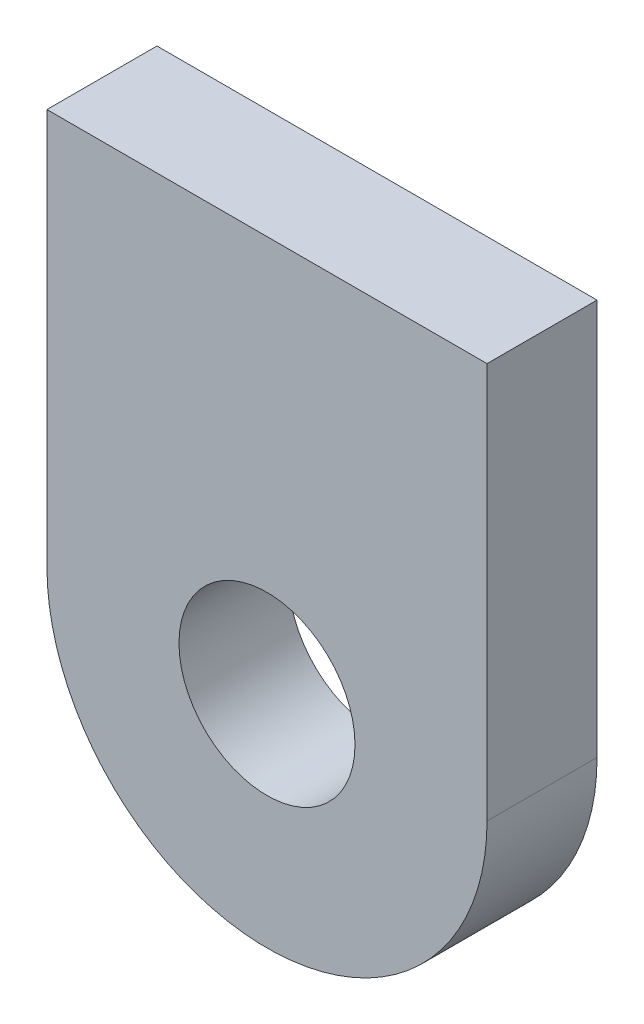
ISO-10303-21;
HEADER;
FILE_DESCRIPTION(('STEP AP214'),'2;1');
FILE_NAME('part.step','',(''),(''),'','','');
FILE_SCHEMA(('AUTOMOTIVE_DESIGN { 1 0 10303 214 1 1 1 1 }'));
ENDSEC;
DATA;
#1=APPLICATION_CONTEXT('core data for automotive mechanical design processes');
#2=APPLICATION_PROTOCOL_DEFINITION('international standard','automotive_design',2000,#1);
#3=PRODUCT_CONTEXT('',#1,'mechanical');
#4=PRODUCT('Part','Part','',(#3));
#5=PRODUCT_RELATED_PRODUCT_CATEGORY('part','',(#4));
#6=PRODUCT_DEFINITION_FORMATION('','',#4);
#7=PRODUCT_DEFINITION_CONTEXT('part definition',#1,'design');
#8=PRODUCT_DEFINITION('design','',#6,#7);
#9=PRODUCT_DEFINITION_SHAPE('','',#8);
#10=(LENGTH_UNIT() NAMED_UNIT(*) SI_UNIT(.MILLI.,.METRE.));
#11=(NAMED_UNIT(*) PLANE_ANGLE_UNIT() SI_UNIT($,.RADIAN.));
#12=(NAMED_UNIT(*) SI_UNIT($,.STERADIAN.) SOLID_ANGLE_UNIT());
#13=UNCERTAINTY_MEASURE_WITH_UNIT(LENGTH_MEASURE(1.E-05),#10,'distance_accuracy_value','');
#14=(GEOMETRIC_REPRESENTATION_CONTEXT(3) GLOBAL_UNCERTAINTY_ASSIGNED_CONTEXT((#13)) GLOBAL_UNIT_ASSIGNED_CONTEXT((#10,
#11,#12)) REPRESENTATION_CONTEXT('',''));
#15=CARTESIAN_POINT('',(0.,0.,0.));
#16=DIRECTION('',(0.,0.,1.));
#17=DIRECTION('',(1.,0.,0.));
#18=AXIS2_PLACEMENT_3D('',#15,#16,#17);
#19=CARTESIAN_POINT('',(0.,0.,5.));
#20=DIRECTION('',(0.,0.,1.));
#21=DIRECTION('',(1.,0.,0.));
#22=AXIS2_PLACEMENT_3D('',#19,#20,#21);
#23=PLANE('',#22);
#24=DIRECTION('',(0.,1.,0.));
#25=VECTOR('',#24,1.);
#26=CARTESIAN_POINT('',(10.,18.,5.));
#27=LINE('',#26,#25);
#28=CARTESIAN_POINT('',(10.,0.,5.));
#29=VERTEX_POINT('',#28);
#30=CARTESIAN_POINT('',(10.,18.,5.));
#31=VERTEX_POINT('',#30);
#32=EDGE_CURVE('E51',#29,#31,#27,.T.);
#33=ORIENTED_EDGE('',*,*,#32,.T.);
#34=DIRECTION('',(-1.,0.,0.));
#35=VECTOR('',#34,1.);
#36=CARTESIAN_POINT('',(-9.99999999999995,18.,5.));
#37=LINE('',#36,#35);
#38=CARTESIAN_POINT('',(-9.99999999999995,18.,5.));
#39=VERTEX_POINT('',#38);
#40=EDGE_CURVE('E81',#31,#39,#37,.T.);
#41=ORIENTED_EDGE('',*,*,#40,.T.);
#42=DIRECTION('',(0.,-1.,0.));
#43=VECTOR('',#42,1.);
#44=CARTESIAN_POINT('',(-9.99999999999995,15.,5.));
#45=LINE('',#44,#43);
#46=CARTESIAN_POINT('',(-9.99999999999995,0.,5.));
#47=VERTEX_POINT('',#46);
#48=EDGE_CURVE('E85',#39,#47,#45,.T.);
#49=ORIENTED_EDGE('',*,*,#48,.T.);
#50=CARTESIAN_POINT('',(0.,0.,5.));
#51=DIRECTION('',(0.,0.,1.));
#52=DIRECTION('',(1.,0.,0.));
#53=AXIS2_PLACEMENT_3D('',#50,#51,#52);
#54=CIRCLE('',#53,10.);
#55=EDGE_CURVE('E93',#47,#29,#54,.T.);
#56=ORIENTED_EDGE('',*,*,#55,.T.);
#57=EDGE_LOOP('',(#33,#41,#49,#56));
#58=FACE_BOUND('',#57,.T.);
#59=CARTESIAN_POINT('',(0.,0.,5.));
#60=DIRECTION('',(0.,0.,1.));
#61=DIRECTION('',(1.,0.,0.));
#62=AXIS2_PLACEMENT_3D('',#59,#60,#61);
#63=CIRCLE('',#62,4.);
#64=CARTESIAN_POINT('',(4.,0.,5.));
#65=VERTEX_POINT('',#64);
#66=EDGE_CURVE('E100',#65,#65,#63,.T.);
#67=ORIENTED_EDGE('',*,*,#66,.F.);
#68=EDGE_LOOP('',(#67));
#69=FACE_BOUND('',#68,.T.);
#70=ADVANCED_FACE('F34',(#58,#69),#23,.T.);
#71=CARTESIAN_POINT('',(0.,0.,0.));
#72=DIRECTION('',(0.,0.,1.));
#73=DIRECTION('',(1.,0.,0.));
#74=AXIS2_PLACEMENT_3D('',#71,#72,#73);
#75=PLANE('',#74);
#76=DIRECTION('',(-1.,0.,0.));
#77=VECTOR('',#76,1.);
#78=CARTESIAN_POINT('',(-9.99999999999995,18.,0.));
#79=LINE('',#78,#77);
#80=CARTESIAN_POINT('',(10.,18.,0.));
#81=VERTEX_POINT('',#80);
#82=CARTESIAN_POINT('',(-9.99999999999995,18.,0.));
#83=VERTEX_POINT('',#82);
#84=EDGE_CURVE('E89',#81,#83,#79,.T.);
#85=ORIENTED_EDGE('',*,*,#84,.F.);
#86=DIRECTION('',(0.,1.,0.));
#87=VECTOR('',#86,1.);
#88=CARTESIAN_POINT('',(10.,0.,0.));
#89=LINE('',#88,#87);
#90=CARTESIAN_POINT('',(10.,0.,0.));
#91=VERTEX_POINT('',#90);
#92=EDGE_CURVE('E103',#91,#81,#89,.T.);
#93=ORIENTED_EDGE('',*,*,#92,.F.);
#94=CARTESIAN_POINT('',(0.,0.,0.));
#95=DIRECTION('',(0.,0.,1.));
#96=DIRECTION('',(1.,0.,0.));
#97=AXIS2_PLACEMENT_3D('',#94,#95,#96);
#98=CIRCLE('',#97,10.);
#99=CARTESIAN_POINT('',(-9.99999999999995,0.,0.));
#100=VERTEX_POINT('',#99);
#101=EDGE_CURVE('E75',#100,#91,#98,.T.);
#102=ORIENTED_EDGE('',*,*,#101,.F.);
#103=DIRECTION('',(0.,-1.,0.));
#104=VECTOR('',#103,1.);
#105=CARTESIAN_POINT('',(-9.99999999999995,15.,0.));
#106=LINE('',#105,#104);
#107=EDGE_CURVE('E68',#83,#100,#106,.T.);
#108=ORIENTED_EDGE('',*,*,#107,.F.);
#109=EDGE_LOOP('',(#85,#93,#102,#108));
#110=FACE_BOUND('',#109,.T.);
#111=CARTESIAN_POINT('',(0.,0.,0.));
#112=DIRECTION('',(0.,0.,1.));
#113=DIRECTION('',(1.,0.,0.));
#114=AXIS2_PLACEMENT_3D('',#111,#112,#113);
#115=CIRCLE('',#114,4.);
#116=CARTESIAN_POINT('',(4.,0.,0.));
#117=VERTEX_POINT('',#116);
#118=EDGE_CURVE('E179',#117,#117,#115,.T.);
#119=ORIENTED_EDGE('',*,*,#118,.T.);
#120=EDGE_LOOP('',(#119));
#121=FACE_BOUND('',#120,.T.);
#122=ADVANCED_FACE('F109',(#110,#121),#75,.F.);
#123=CARTESIAN_POINT('',(-9.99999999999995,18.,5.));
#124=DIRECTION('',(0.,-1.,0.));
#125=DIRECTION('',(0.,0.,-1.));
#126=AXIS2_PLACEMENT_3D('',#123,#124,#125);
#127=PLANE('',#126);
#128=ORIENTED_EDGE('',*,*,#84,.T.);
#129=DIRECTION('',(0.,0.,-1.));
#130=VECTOR('',#129,1.);
#131=CARTESIAN_POINT('',(-9.99999999999995,18.,5.));
#132=LINE('',#131,#130);
#133=EDGE_CURVE('E43',#39,#83,#132,.T.);
#134=ORIENTED_EDGE('',*,*,#133,.F.);
#135=ORIENTED_EDGE('',*,*,#40,.F.);
#136=DIRECTION('',(0.,0.,-1.));
#137=VECTOR('',#136,1.);
#138=CARTESIAN_POINT('',(10.,18.,5.));
#139=LINE('',#138,#137);
#140=EDGE_CURVE('E11',#31,#81,#139,.T.);
#141=ORIENTED_EDGE('',*,*,#140,.T.);
#142=EDGE_LOOP('',(#128,#134,#135,#141));
#143=FACE_BOUND('',#142,.T.);
#144=ADVANCED_FACE('F36',(#143),#127,.F.);
#145=CARTESIAN_POINT('',(-9.99999999999995,15.,5.));
#146=DIRECTION('',(1.,0.,0.));
#147=DIRECTION('',(0.,0.,-1.));
#148=AXIS2_PLACEMENT_3D('',#145,#146,#147);
#149=PLANE('',#148);
#150=ORIENTED_EDGE('',*,*,#107,.T.);
#151=DIRECTION('',(0.,0.,-1.));
#152=VECTOR('',#151,1.);
#153=CARTESIAN_POINT('',(-9.99999999999995,0.,5.));
#154=LINE('',#153,#152);
#155=EDGE_CURVE('E90',#47,#100,#154,.T.);
#156=ORIENTED_EDGE('',*,*,#155,.F.);
#157=ORIENTED_EDGE('',*,*,#48,.F.);
#158=ORIENTED_EDGE('',*,*,#133,.T.);
#159=EDGE_LOOP('',(#150,#156,#157,#158));
#160=FACE_BOUND('',#159,.T.);
#161=ADVANCED_FACE('F91',(#160),#149,.F.);
#162=CARTESIAN_POINT('',(0.,0.,5.));
#163=DIRECTION('',(0.,0.,-1.));
#164=DIRECTION('',(-1.,0.,0.));
#165=AXIS2_PLACEMENT_3D('',#162,#163,#164);
#166=CYLINDRICAL_SURFACE('',#165,10.);
#167=ORIENTED_EDGE('',*,*,#101,.T.);
#168=DIRECTION('',(0.,0.,-1.));
#169=VECTOR('',#168,1.);
#170=CARTESIAN_POINT('',(10.,0.,5.));
#171=LINE('',#170,#169);
#172=EDGE_CURVE('E95',#29,#91,#171,.T.);
#173=ORIENTED_EDGE('',*,*,#172,.F.);
#174=ORIENTED_EDGE('',*,*,#55,.F.);
#175=ORIENTED_EDGE('',*,*,#155,.T.);
#176=EDGE_LOOP('',(#167,#173,#174,#175));
#177=FACE_BOUND('',#176,.T.);
#178=ADVANCED_FACE('F106',(#177),#166,.T.);
#179=CARTESIAN_POINT('',(10.,0.,5.));
#180=DIRECTION('',(-1.,0.,0.));
#181=DIRECTION('',(0.,-1.,0.));
#182=AXIS2_PLACEMENT_3D('',#179,#180,#181);
#183=PLANE('',#182);
#184=ORIENTED_EDGE('',*,*,#92,.T.);
#185=ORIENTED_EDGE('',*,*,#140,.F.);
#186=ORIENTED_EDGE('',*,*,#32,.F.);
#187=ORIENTED_EDGE('',*,*,#172,.T.);
#188=EDGE_LOOP('',(#184,#185,#186,#187));
#189=FACE_BOUND('',#188,.T.);
#190=ADVANCED_FACE('F111',(#189),#183,.F.);
#191=CARTESIAN_POINT('',(0.,0.,5.));
#192=DIRECTION('',(0.,0.,-1.));
#193=DIRECTION('',(-1.,0.,0.));
#194=AXIS2_PLACEMENT_3D('',#191,#192,#193);
#195=CYLINDRICAL_SURFACE('',#194,4.);
#196=ORIENTED_EDGE('',*,*,#66,.T.);
#197=EDGE_LOOP('',(#196));
#198=FACE_BOUND('',#197,.T.);
#199=ORIENTED_EDGE('',*,*,#118,.F.);
#200=EDGE_LOOP('',(#199));
#201=FACE_BOUND('',#200,.T.);
#202=ADVANCED_FACE('F113',(#198,#201),#195,.F.);
#203=CLOSED_SHELL('',(#70,#122,#144,#161,#178,#190,#202));
#204=MANIFOLD_SOLID_BREP('B2',#203);
#205=ADVANCED_BREP_SHAPE_REPRESENTATION('',(#18,#204),#14);
#206=SHAPE_DEFINITION_REPRESENTATION(#9,#205);
ENDSEC;
END-ISO-10303-21;
